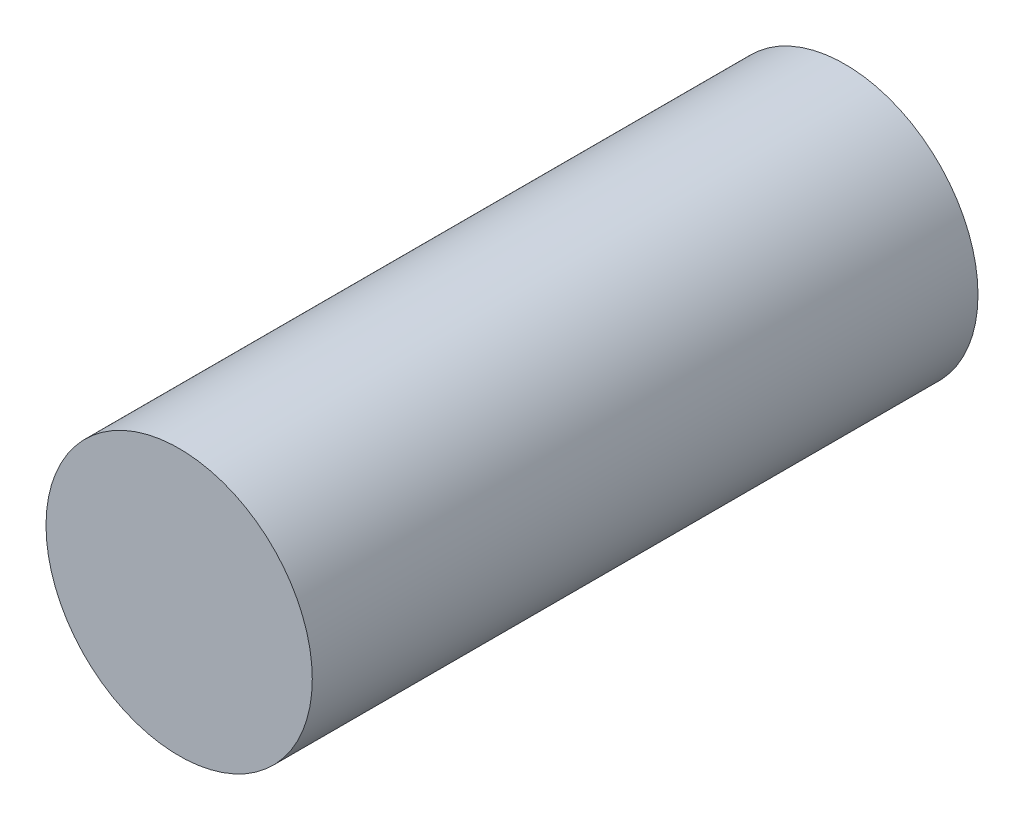
ISO-10303-21;
HEADER;
FILE_DESCRIPTION(('STEP AP214'),'2;1');
FILE_NAME('part.step','',(''),(''),'','','');
FILE_SCHEMA(('AUTOMOTIVE_DESIGN { 1 0 10303 214 1 1 1 1 }'));
ENDSEC;
DATA;
#1=APPLICATION_CONTEXT('core data for automotive mechanical design processes');
#2=APPLICATION_PROTOCOL_DEFINITION('international standard','automotive_design',2000,#1);
#3=PRODUCT_CONTEXT('',#1,'mechanical');
#4=PRODUCT('Part','Part','',(#3));
#5=PRODUCT_RELATED_PRODUCT_CATEGORY('part','',(#4));
#6=PRODUCT_DEFINITION_FORMATION('','',#4);
#7=PRODUCT_DEFINITION_CONTEXT('part definition',#1,'design');
#8=PRODUCT_DEFINITION('design','',#6,#7);
#9=PRODUCT_DEFINITION_SHAPE('','',#8);
#10=(LENGTH_UNIT() NAMED_UNIT(*) SI_UNIT(.MILLI.,.METRE.));
#11=(NAMED_UNIT(*) PLANE_ANGLE_UNIT() SI_UNIT($,.RADIAN.));
#12=(NAMED_UNIT(*) SI_UNIT($,.STERADIAN.) SOLID_ANGLE_UNIT());
#13=UNCERTAINTY_MEASURE_WITH_UNIT(LENGTH_MEASURE(1.E-05),#10,'distance_accuracy_value','');
#14=(GEOMETRIC_REPRESENTATION_CONTEXT(3) GLOBAL_UNCERTAINTY_ASSIGNED_CONTEXT((#13)) GLOBAL_UNIT_ASSIGNED_CONTEXT((#10,
#11,#12)) REPRESENTATION_CONTEXT('',''));
#15=CARTESIAN_POINT('',(0.,0.,0.));
#16=DIRECTION('',(0.,0.,1.));
#17=DIRECTION('',(1.,0.,0.));
#18=AXIS2_PLACEMENT_3D('',#15,#16,#17);
#19=CARTESIAN_POINT('',(-53.0011987034432,15.900359611033,150.));
#20=DIRECTION('',(0.,0.,-1.));
#21=DIRECTION('',(-1.,0.,0.));
#22=AXIS2_PLACEMENT_3D('',#19,#20,#21);
#23=CYLINDRICAL_SURFACE('',#22,30.);
#24=CARTESIAN_POINT('',(-53.0011987034432,15.900359611033,150.));
#25=DIRECTION('',(0.,0.,1.));
#26=DIRECTION('',(1.,0.,0.));
#27=AXIS2_PLACEMENT_3D('',#24,#25,#26);
#28=CIRCLE('',#27,30.);
#29=CARTESIAN_POINT('',(-23.0011987034432,15.900359611033,150.));
#30=VERTEX_POINT('',#29);
#31=EDGE_CURVE('E10',#30,#30,#28,.T.);
#32=ORIENTED_EDGE('',*,*,#31,.F.);
#33=EDGE_LOOP('',(#32));
#34=FACE_BOUND('',#33,.T.);
#35=CARTESIAN_POINT('',(-53.0011987034432,15.900359611033,0.));
#36=DIRECTION('',(0.,0.,1.));
#37=DIRECTION('',(1.,0.,0.));
#38=AXIS2_PLACEMENT_3D('',#35,#36,#37);
#39=CIRCLE('',#38,30.);
#40=CARTESIAN_POINT('',(-23.0011987034432,15.900359611033,0.));
#41=VERTEX_POINT('',#40);
#42=EDGE_CURVE('E34',#41,#41,#39,.T.);
#43=ORIENTED_EDGE('',*,*,#42,.T.);
#44=EDGE_LOOP('',(#43));
#45=FACE_BOUND('',#44,.T.);
#46=ADVANCED_FACE('F31',(#34,#45),#23,.T.);
#47=CARTESIAN_POINT('',(-53.0011987034432,15.900359611033,150.));
#48=DIRECTION('',(0.,0.,1.));
#49=DIRECTION('',(1.,0.,0.));
#50=AXIS2_PLACEMENT_3D('',#47,#48,#49);
#51=PLANE('',#50);
#52=ORIENTED_EDGE('',*,*,#31,.T.);
#53=EDGE_LOOP('',(#52));
#54=FACE_BOUND('',#53,.T.);
#55=ADVANCED_FACE('F46',(#54),#51,.T.);
#56=CARTESIAN_POINT('',(-53.0011987034432,15.900359611033,0.));
#57=DIRECTION('',(0.,0.,1.));
#58=DIRECTION('',(1.,0.,0.));
#59=AXIS2_PLACEMENT_3D('',#56,#57,#58);
#60=PLANE('',#59);
#61=ORIENTED_EDGE('',*,*,#42,.F.);
#62=EDGE_LOOP('',(#61));
#63=FACE_BOUND('',#62,.T.);
#64=ADVANCED_FACE('F44',(#63),#60,.F.);
#65=CLOSED_SHELL('',(#46,#55,#64));
#66=MANIFOLD_SOLID_BREP('B2',#65);
#67=ADVANCED_BREP_SHAPE_REPRESENTATION('',(#18,#66),#14);
#68=SHAPE_DEFINITION_REPRESENTATION(#9,#67);
ENDSEC;
END-ISO-10303-21;
